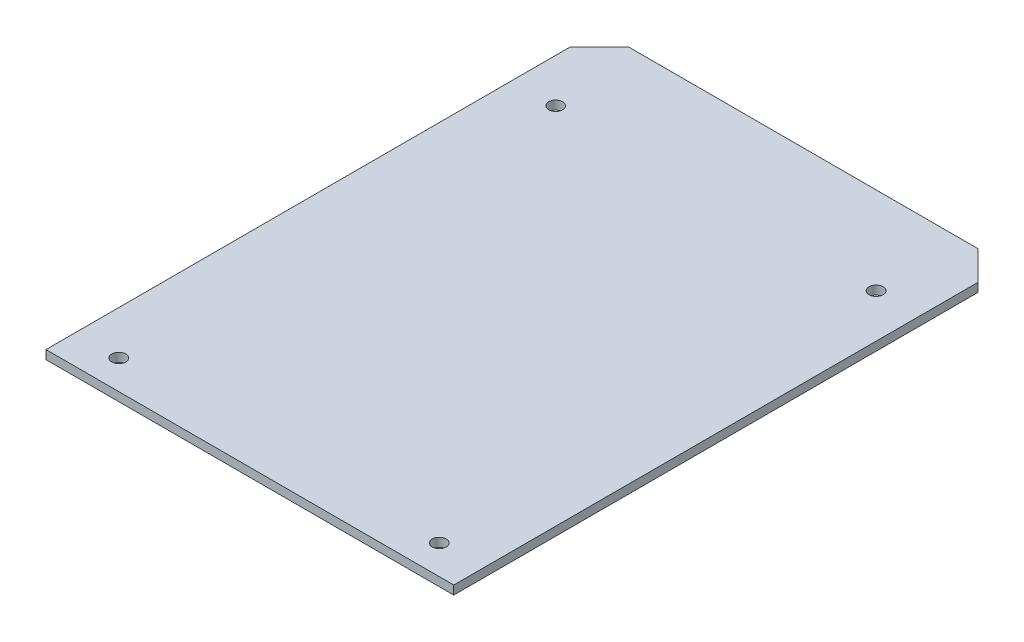
ISO-10303-21;
HEADER;
FILE_DESCRIPTION(('STEP AP214'),'2;1');
FILE_NAME('part.step','',(''),(''),'','','');
FILE_SCHEMA(('AUTOMOTIVE_DESIGN { 1 0 10303 214 1 1 1 1 }'));
ENDSEC;
DATA;
#1=APPLICATION_CONTEXT('core data for automotive mechanical design processes');
#2=APPLICATION_PROTOCOL_DEFINITION('international standard','automotive_design',2000,#1);
#3=PRODUCT_CONTEXT('',#1,'mechanical');
#4=PRODUCT('Part','Part','',(#3));
#5=PRODUCT_RELATED_PRODUCT_CATEGORY('part','',(#4));
#6=PRODUCT_DEFINITION_FORMATION('','',#4);
#7=PRODUCT_DEFINITION_CONTEXT('part definition',#1,'design');
#8=PRODUCT_DEFINITION('design','',#6,#7);
#9=PRODUCT_DEFINITION_SHAPE('','',#8);
#10=(LENGTH_UNIT() NAMED_UNIT(*) SI_UNIT(.MILLI.,.METRE.));
#11=(NAMED_UNIT(*) PLANE_ANGLE_UNIT() SI_UNIT($,.RADIAN.));
#12=(NAMED_UNIT(*) SI_UNIT($,.STERADIAN.) SOLID_ANGLE_UNIT());
#13=UNCERTAINTY_MEASURE_WITH_UNIT(LENGTH_MEASURE(1.E-05),#10,'distance_accuracy_value','');
#14=(GEOMETRIC_REPRESENTATION_CONTEXT(3) GLOBAL_UNCERTAINTY_ASSIGNED_CONTEXT((#13)) GLOBAL_UNIT_ASSIGNED_CONTEXT((#10,
#11,#12)) REPRESENTATION_CONTEXT('',''));
#15=CARTESIAN_POINT('',(0.,0.,0.));
#16=DIRECTION('',(0.,0.,1.));
#17=DIRECTION('',(1.,0.,0.));
#18=AXIS2_PLACEMENT_3D('',#15,#16,#17);
#19=CARTESIAN_POINT('',(-70.,3.,95.));
#20=DIRECTION('',(1.,0.,0.));
#21=DIRECTION('',(0.,0.,-1.));
#22=AXIS2_PLACEMENT_3D('',#19,#20,#21);
#23=PLANE('',#22);
#24=DIRECTION('',(0.,0.,1.));
#25=VECTOR('',#24,1.);
#26=CARTESIAN_POINT('',(-70.,3.,95.));
#27=LINE('',#26,#25);
#28=CARTESIAN_POINT('',(-70.,3.,-85.));
#29=VERTEX_POINT('',#28);
#30=CARTESIAN_POINT('',(-70.,3.,95.));
#31=VERTEX_POINT('',#30);
#32=EDGE_CURVE('E89',#29,#31,#27,.T.);
#33=ORIENTED_EDGE('',*,*,#32,.F.);
#34=DIRECTION('',(0.,-1.,0.));
#35=VECTOR('',#34,1.);
#36=CARTESIAN_POINT('',(-70.,3.,-85.));
#37=LINE('',#36,#35);
#38=CARTESIAN_POINT('',(-70.,0.,-85.));
#39=VERTEX_POINT('',#38);
#40=EDGE_CURVE('E11',#29,#39,#37,.T.);
#41=ORIENTED_EDGE('',*,*,#40,.T.);
#42=DIRECTION('',(0.,0.,1.));
#43=VECTOR('',#42,1.);
#44=CARTESIAN_POINT('',(-70.,0.,95.));
#45=LINE('',#44,#43);
#46=CARTESIAN_POINT('',(-70.,0.,95.));
#47=VERTEX_POINT('',#46);
#48=EDGE_CURVE('E108',#39,#47,#45,.T.);
#49=ORIENTED_EDGE('',*,*,#48,.T.);
#50=DIRECTION('',(0.,-1.,0.));
#51=VECTOR('',#50,1.);
#52=CARTESIAN_POINT('',(-70.,3.,95.));
#53=LINE('',#52,#51);
#54=EDGE_CURVE('E102',#31,#47,#53,.T.);
#55=ORIENTED_EDGE('',*,*,#54,.F.);
#56=EDGE_LOOP('',(#33,#41,#49,#55));
#57=FACE_BOUND('',#56,.T.);
#58=ADVANCED_FACE('F35',(#57),#23,.F.);
#59=CARTESIAN_POINT('',(70.,3.,95.));
#60=DIRECTION('',(0.,0.,-1.));
#61=DIRECTION('',(-1.,0.,0.));
#62=AXIS2_PLACEMENT_3D('',#59,#60,#61);
#63=PLANE('',#62);
#64=DIRECTION('',(1.,0.,0.));
#65=VECTOR('',#64,1.);
#66=CARTESIAN_POINT('',(70.,0.,95.));
#67=LINE('',#66,#65);
#68=CARTESIAN_POINT('',(70.,0.,95.));
#69=VERTEX_POINT('',#68);
#70=EDGE_CURVE('E141',#47,#69,#67,.T.);
#71=ORIENTED_EDGE('',*,*,#70,.T.);
#72=DIRECTION('',(0.,-1.,0.));
#73=VECTOR('',#72,1.);
#74=CARTESIAN_POINT('',(70.,3.,95.));
#75=LINE('',#74,#73);
#76=CARTESIAN_POINT('',(70.,3.,95.));
#77=VERTEX_POINT('',#76);
#78=EDGE_CURVE('E104',#77,#69,#75,.T.);
#79=ORIENTED_EDGE('',*,*,#78,.F.);
#80=DIRECTION('',(1.,0.,0.));
#81=VECTOR('',#80,1.);
#82=CARTESIAN_POINT('',(70.,3.,95.));
#83=LINE('',#82,#81);
#84=EDGE_CURVE('E92',#31,#77,#83,.T.);
#85=ORIENTED_EDGE('',*,*,#84,.F.);
#86=ORIENTED_EDGE('',*,*,#54,.T.);
#87=EDGE_LOOP('',(#71,#79,#85,#86));
#88=FACE_BOUND('',#87,.T.);
#89=ADVANCED_FACE('F101',(#88),#63,.F.);
#90=CARTESIAN_POINT('',(70.,3.,95.));
#91=DIRECTION('',(-1.,0.,0.));
#92=DIRECTION('',(0.,0.,1.));
#93=AXIS2_PLACEMENT_3D('',#90,#91,#92);
#94=PLANE('',#93);
#95=DIRECTION('',(0.,0.,-1.));
#96=VECTOR('',#95,1.);
#97=CARTESIAN_POINT('',(70.,0.,95.));
#98=LINE('',#97,#96);
#99=CARTESIAN_POINT('',(70.,0.,-85.));
#100=VERTEX_POINT('',#99);
#101=EDGE_CURVE('E139',#69,#100,#98,.T.);
#102=ORIENTED_EDGE('',*,*,#101,.T.);
#103=DIRECTION('',(0.,1.,0.));
#104=VECTOR('',#103,1.);
#105=CARTESIAN_POINT('',(70.,3.,-85.));
#106=LINE('',#105,#104);
#107=CARTESIAN_POINT('',(70.,3.,-85.));
#108=VERTEX_POINT('',#107);
#109=EDGE_CURVE('E59',#100,#108,#106,.T.);
#110=ORIENTED_EDGE('',*,*,#109,.T.);
#111=DIRECTION('',(0.,0.,-1.));
#112=VECTOR('',#111,1.);
#113=CARTESIAN_POINT('',(70.,3.,95.));
#114=LINE('',#113,#112);
#115=EDGE_CURVE('E105',#77,#108,#114,.T.);
#116=ORIENTED_EDGE('',*,*,#115,.F.);
#117=ORIENTED_EDGE('',*,*,#78,.T.);
#118=EDGE_LOOP('',(#102,#110,#116,#117));
#119=FACE_BOUND('',#118,.T.);
#120=ADVANCED_FACE('F140',(#119),#94,.F.);
#121=CARTESIAN_POINT('',(70.,3.,-95.));
#122=DIRECTION('',(0.,0.,1.));
#123=DIRECTION('',(1.,0.,0.));
#124=AXIS2_PLACEMENT_3D('',#121,#122,#123);
#125=PLANE('',#124);
#126=DIRECTION('',(-1.,0.,0.));
#127=VECTOR('',#126,1.);
#128=CARTESIAN_POINT('',(70.,3.,-95.));
#129=LINE('',#128,#127);
#130=CARTESIAN_POINT('',(60.,3.,-95.));
#131=VERTEX_POINT('',#130);
#132=CARTESIAN_POINT('',(-60.,3.,-95.));
#133=VERTEX_POINT('',#132);
#134=EDGE_CURVE('E114',#131,#133,#129,.T.);
#135=ORIENTED_EDGE('',*,*,#134,.F.);
#136=DIRECTION('',(0.,-1.,0.));
#137=VECTOR('',#136,1.);
#138=CARTESIAN_POINT('',(60.,3.,-95.));
#139=LINE('',#138,#137);
#140=CARTESIAN_POINT('',(60.,0.,-95.));
#141=VERTEX_POINT('',#140);
#142=EDGE_CURVE('E112',#131,#141,#139,.T.);
#143=ORIENTED_EDGE('',*,*,#142,.T.);
#144=DIRECTION('',(-1.,0.,0.));
#145=VECTOR('',#144,1.);
#146=CARTESIAN_POINT('',(70.,0.,-95.));
#147=LINE('',#146,#145);
#148=CARTESIAN_POINT('',(-60.,0.,-95.));
#149=VERTEX_POINT('',#148);
#150=EDGE_CURVE('E97',#141,#149,#147,.T.);
#151=ORIENTED_EDGE('',*,*,#150,.T.);
#152=DIRECTION('',(0.,1.,0.));
#153=VECTOR('',#152,1.);
#154=CARTESIAN_POINT('',(-60.,3.,-95.));
#155=LINE('',#154,#153);
#156=EDGE_CURVE('E110',#149,#133,#155,.T.);
#157=ORIENTED_EDGE('',*,*,#156,.T.);
#158=EDGE_LOOP('',(#135,#143,#151,#157));
#159=FACE_BOUND('',#158,.T.);
#160=ADVANCED_FACE('F130',(#159),#125,.F.);
#161=CARTESIAN_POINT('',(0.,3.,0.));
#162=DIRECTION('',(0.,1.,0.));
#163=DIRECTION('',(0.,0.,1.));
#164=AXIS2_PLACEMENT_3D('',#161,#162,#163);
#165=PLANE('',#164);
#166=CARTESIAN_POINT('',(-55.,3.,85.));
#167=DIRECTION('',(0.,1.,0.));
#168=DIRECTION('',(0.,0.,1.));
#169=AXIS2_PLACEMENT_3D('',#166,#167,#168);
#170=CIRCLE('',#169,2.39999999999999);
#171=CARTESIAN_POINT('',(-55.,3.,87.4));
#172=VERTEX_POINT('',#171);
#173=EDGE_CURVE('E168',#172,#172,#170,.T.);
#174=ORIENTED_EDGE('',*,*,#173,.F.);
#175=EDGE_LOOP('',(#174));
#176=FACE_BOUND('',#175,.T.);
#177=CARTESIAN_POINT('',(55.,3.,85.));
#178=DIRECTION('',(0.,1.,0.));
#179=DIRECTION('',(0.,0.,1.));
#180=AXIS2_PLACEMENT_3D('',#177,#178,#179);
#181=CIRCLE('',#180,2.39999999999999);
#182=CARTESIAN_POINT('',(55.,3.,87.4));
#183=VERTEX_POINT('',#182);
#184=EDGE_CURVE('E162',#183,#183,#181,.T.);
#185=ORIENTED_EDGE('',*,*,#184,.F.);
#186=EDGE_LOOP('',(#185));
#187=FACE_BOUND('',#186,.T.);
#188=CARTESIAN_POINT('',(-55.,3.,-65.));
#189=DIRECTION('',(0.,1.,0.));
#190=DIRECTION('',(0.,0.,1.));
#191=AXIS2_PLACEMENT_3D('',#188,#189,#190);
#192=CIRCLE('',#191,2.39999999999999);
#193=CARTESIAN_POINT('',(-55.,3.,-62.6));
#194=VERTEX_POINT('',#193);
#195=EDGE_CURVE('E156',#194,#194,#192,.T.);
#196=ORIENTED_EDGE('',*,*,#195,.F.);
#197=EDGE_LOOP('',(#196));
#198=FACE_BOUND('',#197,.T.);
#199=CARTESIAN_POINT('',(55.,3.,-65.));
#200=DIRECTION('',(0.,1.,0.));
#201=DIRECTION('',(0.,0.,1.));
#202=AXIS2_PLACEMENT_3D('',#199,#200,#201);
#203=CIRCLE('',#202,2.39999999999999);
#204=CARTESIAN_POINT('',(55.,3.,-62.6));
#205=VERTEX_POINT('',#204);
#206=EDGE_CURVE('E150',#205,#205,#203,.T.);
#207=ORIENTED_EDGE('',*,*,#206,.F.);
#208=EDGE_LOOP('',(#207));
#209=FACE_BOUND('',#208,.T.);
#210=ORIENTED_EDGE('',*,*,#115,.T.);
#211=DIRECTION('',(0.707106781186546,0.,0.707106781186549));
#212=VECTOR('',#211,1.);
#213=CARTESIAN_POINT('',(77.5000000000002,3.,-77.4999999999997));
#214=LINE('',#213,#212);
#215=EDGE_CURVE('E44',#108,#131,#214,.F.);
#216=ORIENTED_EDGE('',*,*,#215,.T.);
#217=ORIENTED_EDGE('',*,*,#134,.T.);
#218=DIRECTION('',(0.707106781186548,0.,-0.707106781186547));
#219=VECTOR('',#218,1.);
#220=CARTESIAN_POINT('',(-77.4999999999999,3.,-77.5000000000001));
#221=LINE('',#220,#219);
#222=EDGE_CURVE('E51',#133,#29,#221,.F.);
#223=ORIENTED_EDGE('',*,*,#222,.T.);
#224=ORIENTED_EDGE('',*,*,#32,.T.);
#225=ORIENTED_EDGE('',*,*,#84,.T.);
#226=EDGE_LOOP('',(#210,#216,#217,#223,#224,#225));
#227=FACE_BOUND('',#226,.T.);
#228=ADVANCED_FACE('F91',(#176,#187,#198,#209,#227),#165,.T.);
#229=CARTESIAN_POINT('',(0.,0.,0.));
#230=DIRECTION('',(0.,1.,0.));
#231=DIRECTION('',(0.,0.,1.));
#232=AXIS2_PLACEMENT_3D('',#229,#230,#231);
#233=PLANE('',#232);
#234=CARTESIAN_POINT('',(-55.,0.,85.));
#235=DIRECTION('',(0.,1.,0.));
#236=DIRECTION('',(0.,0.,1.));
#237=AXIS2_PLACEMENT_3D('',#234,#235,#236);
#238=CIRCLE('',#237,2.39999999999999);
#239=CARTESIAN_POINT('',(-55.,0.,87.4));
#240=VERTEX_POINT('',#239);
#241=EDGE_CURVE('E165',#240,#240,#238,.T.);
#242=ORIENTED_EDGE('',*,*,#241,.T.);
#243=EDGE_LOOP('',(#242));
#244=FACE_BOUND('',#243,.T.);
#245=CARTESIAN_POINT('',(55.,0.,85.));
#246=DIRECTION('',(0.,1.,0.));
#247=DIRECTION('',(0.,0.,1.));
#248=AXIS2_PLACEMENT_3D('',#245,#246,#247);
#249=CIRCLE('',#248,2.39999999999999);
#250=CARTESIAN_POINT('',(55.,0.,87.4));
#251=VERTEX_POINT('',#250);
#252=EDGE_CURVE('E159',#251,#251,#249,.T.);
#253=ORIENTED_EDGE('',*,*,#252,.T.);
#254=EDGE_LOOP('',(#253));
#255=FACE_BOUND('',#254,.T.);
#256=CARTESIAN_POINT('',(-55.,0.,-65.));
#257=DIRECTION('',(0.,1.,0.));
#258=DIRECTION('',(0.,0.,1.));
#259=AXIS2_PLACEMENT_3D('',#256,#257,#258);
#260=CIRCLE('',#259,2.39999999999999);
#261=CARTESIAN_POINT('',(-55.,0.,-62.6));
#262=VERTEX_POINT('',#261);
#263=EDGE_CURVE('E153',#262,#262,#260,.T.);
#264=ORIENTED_EDGE('',*,*,#263,.T.);
#265=EDGE_LOOP('',(#264));
#266=FACE_BOUND('',#265,.T.);
#267=CARTESIAN_POINT('',(55.,0.,-65.));
#268=DIRECTION('',(0.,1.,0.));
#269=DIRECTION('',(0.,0.,1.));
#270=AXIS2_PLACEMENT_3D('',#267,#268,#269);
#271=CIRCLE('',#270,2.39999999999999);
#272=CARTESIAN_POINT('',(55.,0.,-62.6));
#273=VERTEX_POINT('',#272);
#274=EDGE_CURVE('E145',#273,#273,#271,.T.);
#275=ORIENTED_EDGE('',*,*,#274,.T.);
#276=EDGE_LOOP('',(#275));
#277=FACE_BOUND('',#276,.T.);
#278=ORIENTED_EDGE('',*,*,#150,.F.);
#279=DIRECTION('',(-0.707106781186546,0.,-0.707106781186549));
#280=VECTOR('',#279,1.);
#281=CARTESIAN_POINT('',(60.,0.,-95.));
#282=LINE('',#281,#280);
#283=EDGE_CURVE('E122',#141,#100,#282,.F.);
#284=ORIENTED_EDGE('',*,*,#283,.T.);
#285=ORIENTED_EDGE('',*,*,#101,.F.);
#286=ORIENTED_EDGE('',*,*,#70,.F.);
#287=ORIENTED_EDGE('',*,*,#48,.F.);
#288=DIRECTION('',(-0.707106781186548,0.,0.707106781186547));
#289=VECTOR('',#288,1.);
#290=CARTESIAN_POINT('',(-70.,0.,-85.));
#291=LINE('',#290,#289);
#292=EDGE_CURVE('E120',#39,#149,#291,.F.);
#293=ORIENTED_EDGE('',*,*,#292,.T.);
#294=EDGE_LOOP('',(#278,#284,#285,#286,#287,#293));
#295=FACE_BOUND('',#294,.T.);
#296=ADVANCED_FACE('F138',(#244,#255,#266,#277,#295),#233,.F.);
#297=CARTESIAN_POINT('',(55.,3.,-65.));
#298=DIRECTION('',(0.,1.,0.));
#299=DIRECTION('',(0.,0.,1.));
#300=AXIS2_PLACEMENT_3D('',#297,#298,#299);
#301=CYLINDRICAL_SURFACE('',#300,2.39999999999999);
#302=ORIENTED_EDGE('',*,*,#274,.F.);
#303=EDGE_LOOP('',(#302));
#304=FACE_BOUND('',#303,.T.);
#305=ORIENTED_EDGE('',*,*,#206,.T.);
#306=EDGE_LOOP('',(#305));
#307=FACE_BOUND('',#306,.T.);
#308=ADVANCED_FACE('F183',(#304,#307),#301,.F.);
#309=CARTESIAN_POINT('',(-55.,3.,-65.));
#310=DIRECTION('',(0.,1.,0.));
#311=DIRECTION('',(0.,0.,1.));
#312=AXIS2_PLACEMENT_3D('',#309,#310,#311);
#313=CYLINDRICAL_SURFACE('',#312,2.39999999999999);
#314=ORIENTED_EDGE('',*,*,#263,.F.);
#315=EDGE_LOOP('',(#314));
#316=FACE_BOUND('',#315,.T.);
#317=ORIENTED_EDGE('',*,*,#195,.T.);
#318=EDGE_LOOP('',(#317));
#319=FACE_BOUND('',#318,.T.);
#320=ADVANCED_FACE('F185',(#316,#319),#313,.F.);
#321=CARTESIAN_POINT('',(55.,3.,85.));
#322=DIRECTION('',(0.,1.,0.));
#323=DIRECTION('',(0.,0.,1.));
#324=AXIS2_PLACEMENT_3D('',#321,#322,#323);
#325=CYLINDRICAL_SURFACE('',#324,2.39999999999999);
#326=ORIENTED_EDGE('',*,*,#252,.F.);
#327=EDGE_LOOP('',(#326));
#328=FACE_BOUND('',#327,.T.);
#329=ORIENTED_EDGE('',*,*,#184,.T.);
#330=EDGE_LOOP('',(#329));
#331=FACE_BOUND('',#330,.T.);
#332=ADVANCED_FACE('F192',(#328,#331),#325,.F.);
#333=CARTESIAN_POINT('',(-55.,3.,85.));
#334=DIRECTION('',(0.,1.,0.));
#335=DIRECTION('',(0.,0.,1.));
#336=AXIS2_PLACEMENT_3D('',#333,#334,#335);
#337=CYLINDRICAL_SURFACE('',#336,2.39999999999999);
#338=ORIENTED_EDGE('',*,*,#241,.F.);
#339=EDGE_LOOP('',(#338));
#340=FACE_BOUND('',#339,.T.);
#341=ORIENTED_EDGE('',*,*,#173,.T.);
#342=EDGE_LOOP('',(#341));
#343=FACE_BOUND('',#342,.T.);
#344=ADVANCED_FACE('F172',(#340,#343),#337,.F.);
#345=CARTESIAN_POINT('',(60.,3.,-95.));
#346=DIRECTION('',(-0.707106781186549,0.,0.707106781186545));
#347=DIRECTION('',(0.,-1.,0.));
#348=AXIS2_PLACEMENT_3D('',#345,#346,#347);
#349=PLANE('',#348);
#350=ORIENTED_EDGE('',*,*,#215,.F.);
#351=ORIENTED_EDGE('',*,*,#109,.F.);
#352=ORIENTED_EDGE('',*,*,#283,.F.);
#353=ORIENTED_EDGE('',*,*,#142,.F.);
#354=EDGE_LOOP('',(#350,#351,#352,#353));
#355=FACE_BOUND('',#354,.T.);
#356=ADVANCED_FACE('F135',(#355),#349,.F.);
#357=CARTESIAN_POINT('',(-70.,3.,-85.));
#358=DIRECTION('',(0.707106781186547,0.,0.707106781186548));
#359=DIRECTION('',(0.,-1.,0.));
#360=AXIS2_PLACEMENT_3D('',#357,#358,#359);
#361=PLANE('',#360);
#362=ORIENTED_EDGE('',*,*,#222,.F.);
#363=ORIENTED_EDGE('',*,*,#156,.F.);
#364=ORIENTED_EDGE('',*,*,#292,.F.);
#365=ORIENTED_EDGE('',*,*,#40,.F.);
#366=EDGE_LOOP('',(#362,#363,#364,#365));
#367=FACE_BOUND('',#366,.T.);
#368=ADVANCED_FACE('F38',(#367),#361,.F.);
#369=CLOSED_SHELL('',(#58,#89,#120,#160,#228,#296,#308,#320,#332,#344,#356,#368));
#370=MANIFOLD_SOLID_BREP('B2',#369);
#371=ADVANCED_BREP_SHAPE_REPRESENTATION('',(#18,#370),#14);
#372=SHAPE_DEFINITION_REPRESENTATION(#9,#371);
ENDSEC;
END-ISO-10303-21;
